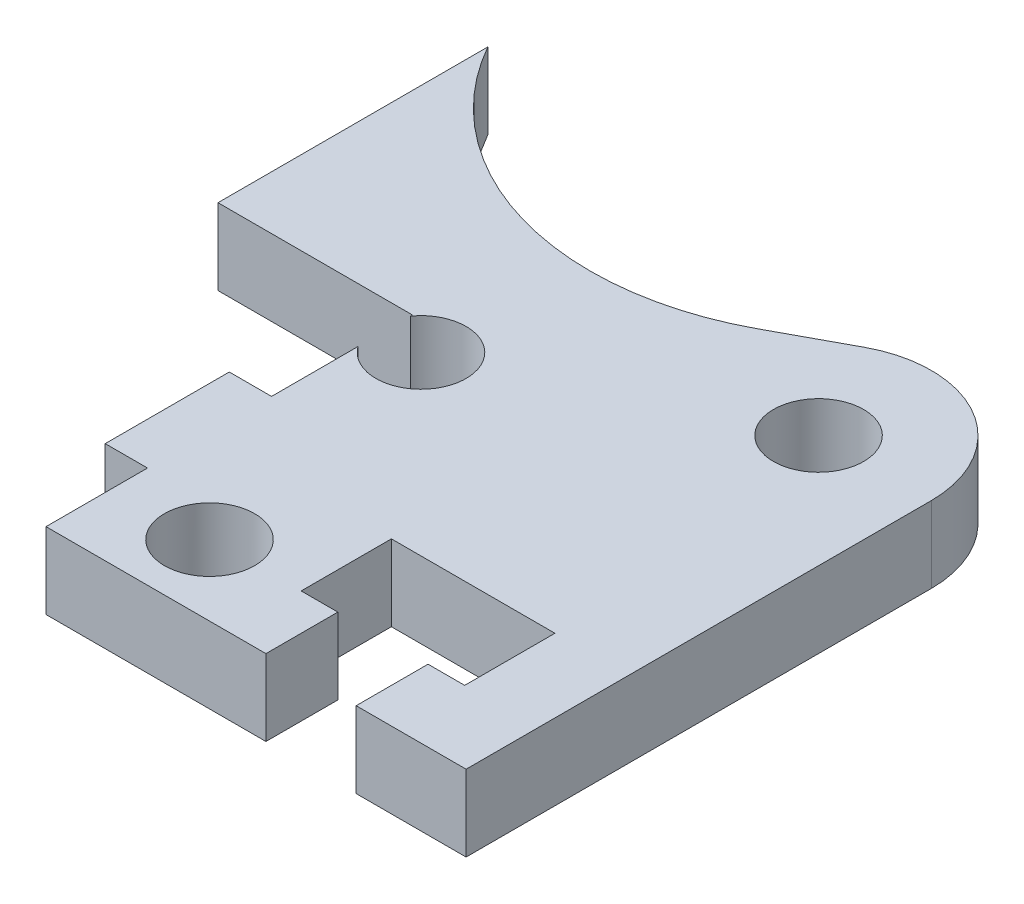
ISO-10303-21;
HEADER;
FILE_DESCRIPTION(('STEP AP214'),'2;1');
FILE_NAME('part.step','',(''),(''),'','','');
FILE_SCHEMA(('AUTOMOTIVE_DESIGN { 1 0 10303 214 1 1 1 1 }'));
ENDSEC;
DATA;
#1=APPLICATION_CONTEXT('core data for automotive mechanical design processes');
#2=APPLICATION_PROTOCOL_DEFINITION('international standard','automotive_design',2000,#1);
#3=PRODUCT_CONTEXT('',#1,'mechanical');
#4=PRODUCT('Part','Part','',(#3));
#5=PRODUCT_RELATED_PRODUCT_CATEGORY('part','',(#4));
#6=PRODUCT_DEFINITION_FORMATION('','',#4);
#7=PRODUCT_DEFINITION_CONTEXT('part definition',#1,'design');
#8=PRODUCT_DEFINITION('design','',#6,#7);
#9=PRODUCT_DEFINITION_SHAPE('','',#8);
#10=(LENGTH_UNIT() NAMED_UNIT(*) SI_UNIT(.MILLI.,.METRE.));
#11=(NAMED_UNIT(*) PLANE_ANGLE_UNIT() SI_UNIT($,.RADIAN.));
#12=(NAMED_UNIT(*) SI_UNIT($,.STERADIAN.) SOLID_ANGLE_UNIT());
#13=UNCERTAINTY_MEASURE_WITH_UNIT(LENGTH_MEASURE(1.E-05),#10,'distance_accuracy_value','');
#14=(GEOMETRIC_REPRESENTATION_CONTEXT(3) GLOBAL_UNCERTAINTY_ASSIGNED_CONTEXT((#13)) GLOBAL_UNIT_ASSIGNED_CONTEXT((#10,
#11,#12)) REPRESENTATION_CONTEXT('',''));
#15=CARTESIAN_POINT('',(0.,0.,0.));
#16=DIRECTION('',(0.,0.,1.));
#17=DIRECTION('',(1.,0.,0.));
#18=AXIS2_PLACEMENT_3D('',#15,#16,#17);
#19=CARTESIAN_POINT('',(0.,-1.35,0.));
#20=DIRECTION('',(0.,1.,0.));
#21=DIRECTION('',(1.,0.,0.));
#22=AXIS2_PLACEMENT_3D('',#19,#20,#21);
#23=PLANE('',#22);
#24=DIRECTION('',(1.,0.,0.));
#25=VECTOR('',#24,1.);
#26=CARTESIAN_POINT('',(14.2,-1.35,27.5));
#27=LINE('',#26,#25);
#28=CARTESIAN_POINT('',(14.2,-1.35,27.5));
#29=VERTEX_POINT('',#28);
#30=CARTESIAN_POINT('',(22.,-1.35,27.5));
#31=VERTEX_POINT('',#30);
#32=EDGE_CURVE('E35',#29,#31,#27,.T.);
#33=ORIENTED_EDGE('',*,*,#32,.F.);
#34=DIRECTION('',(0.,0.,-1.));
#35=VECTOR('',#34,1.);
#36=CARTESIAN_POINT('',(14.2,-1.35,27.5));
#37=LINE('',#36,#35);
#38=CARTESIAN_POINT('',(14.2,-1.35,23.9));
#39=VERTEX_POINT('',#38);
#40=EDGE_CURVE('E11',#29,#39,#37,.T.);
#41=ORIENTED_EDGE('',*,*,#40,.T.);
#42=DIRECTION('',(-1.,0.,0.));
#43=VECTOR('',#42,1.);
#44=CARTESIAN_POINT('',(14.2,-1.35,23.9));
#45=LINE('',#44,#43);
#46=CARTESIAN_POINT('',(12.7,-1.35,23.9));
#47=VERTEX_POINT('',#46);
#48=EDGE_CURVE('E27',#39,#47,#45,.T.);
#49=ORIENTED_EDGE('',*,*,#48,.T.);
#50=DIRECTION('',(0.,0.,-1.));
#51=VECTOR('',#50,1.);
#52=CARTESIAN_POINT('',(12.7,-1.35,23.9));
#53=LINE('',#52,#51);
#54=CARTESIAN_POINT('',(12.7,-1.35,19.5));
#55=VERTEX_POINT('',#54);
#56=EDGE_CURVE('E376',#47,#55,#53,.T.);
#57=ORIENTED_EDGE('',*,*,#56,.T.);
#58=DIRECTION('',(1.,0.,0.));
#59=VECTOR('',#58,1.);
#60=CARTESIAN_POINT('',(12.7,-1.35,19.5));
#61=LINE('',#60,#59);
#62=CARTESIAN_POINT('',(14.2,-1.35,19.5));
#63=VERTEX_POINT('',#62);
#64=EDGE_CURVE('E373',#55,#63,#61,.T.);
#65=ORIENTED_EDGE('',*,*,#64,.T.);
#66=DIRECTION('',(0.,0.,-1.));
#67=VECTOR('',#66,1.);
#68=CARTESIAN_POINT('',(14.2,-1.35,19.5));
#69=LINE('',#68,#67);
#70=CARTESIAN_POINT('',(14.2,-1.35,16.43273790531));
#71=VERTEX_POINT('',#70);
#72=EDGE_CURVE('E370',#63,#71,#69,.T.);
#73=ORIENTED_EDGE('',*,*,#72,.T.);
#74=CARTESIAN_POINT('',(15.5,-1.35,15.5));
#75=DIRECTION('',(0.,1.,0.));
#76=DIRECTION('',(-0.812499999999977,0.,0.582961190818083));
#77=AXIS2_PLACEMENT_3D('',#74,#75,#76);
#78=CIRCLE('',#77,1.6);
#79=CARTESIAN_POINT('',(14.2,-1.35,14.56726209469));
#80=VERTEX_POINT('',#79);
#81=EDGE_CURVE('E367',#71,#80,#78,.T.);
#82=ORIENTED_EDGE('',*,*,#81,.T.);
#83=DIRECTION('',(0.,0.,-1.));
#84=VECTOR('',#83,1.);
#85=CARTESIAN_POINT('',(14.2,-1.35,14.56726209469));
#86=LINE('',#85,#84);
#87=CARTESIAN_POINT('',(14.2,-1.35,14.5));
#88=VERTEX_POINT('',#87);
#89=EDGE_CURVE('E364',#80,#88,#86,.T.);
#90=ORIENTED_EDGE('',*,*,#89,.T.);
#91=DIRECTION('',(-1.,0.,0.));
#92=VECTOR('',#91,1.);
#93=CARTESIAN_POINT('',(14.2,-1.35,14.5));
#94=LINE('',#93,#92);
#95=CARTESIAN_POINT('',(7.3,-1.35,14.5));
#96=VERTEX_POINT('',#95);
#97=EDGE_CURVE('E361',#88,#96,#94,.T.);
#98=ORIENTED_EDGE('',*,*,#97,.T.);
#99=DIRECTION('',(0.,0.,-1.));
#100=VECTOR('',#99,1.);
#101=CARTESIAN_POINT('',(7.3,-1.35,14.5));
#102=LINE('',#101,#100);
#103=CARTESIAN_POINT('',(7.3,-1.35,4.930517214248));
#104=VERTEX_POINT('',#103);
#105=EDGE_CURVE('E358',#96,#104,#102,.T.);
#106=ORIENTED_EDGE('',*,*,#105,.T.);
#107=CARTESIAN_POINT('',(16.,-1.35,0.));
#108=DIRECTION('',(0.,1.,0.));
#109=DIRECTION('',(-0.870000000000018,0.,0.49305172142481));
#110=AXIS2_PLACEMENT_3D('',#107,#108,#109);
#111=CIRCLE('',#110,10.);
#112=CARTESIAN_POINT('',(20.74260267173,-1.35,8.803846880659));
#113=VERTEX_POINT('',#112);
#114=EDGE_CURVE('E355',#104,#113,#111,.T.);
#115=ORIENTED_EDGE('',*,*,#114,.T.);
#116=DIRECTION('',(0.880384688065945,0.,-0.474260267173024));
#117=VECTOR('',#116,1.);
#118=CARTESIAN_POINT('',(20.74260267173,-1.35,8.803846880659));
#119=LINE('',#118,#117);
#120=CARTESIAN_POINT('',(23.20295893131,-1.35,7.478461247736));
#121=VERTEX_POINT('',#120);
#122=EDGE_CURVE('E349',#113,#121,#119,.T.);
#123=ORIENTED_EDGE('',*,*,#122,.T.);
#124=CARTESIAN_POINT('',(25.1,-1.35,11.));
#125=DIRECTION('',(0.,1.,0.));
#126=DIRECTION('',(1.,0.,0.));
#127=AXIS2_PLACEMENT_3D('',#124,#125,#126);
#128=CIRCLE('',#127,4.);
#129=CARTESIAN_POINT('',(29.1,-1.35,11.));
#130=VERTEX_POINT('',#129);
#131=EDGE_CURVE('E249',#130,#121,#128,.T.);
#132=ORIENTED_EDGE('',*,*,#131,.F.);
#133=DIRECTION('',(0.,0.,-1.));
#134=VECTOR('',#133,1.);
#135=CARTESIAN_POINT('',(29.1,-1.35,27.5));
#136=LINE('',#135,#134);
#137=CARTESIAN_POINT('',(29.1,-1.35,27.5));
#138=VERTEX_POINT('',#137);
#139=EDGE_CURVE('E205',#138,#130,#136,.T.);
#140=ORIENTED_EDGE('',*,*,#139,.F.);
#141=DIRECTION('',(1.,0.,0.));
#142=VECTOR('',#141,1.);
#143=CARTESIAN_POINT('',(25.2,-1.35,27.5));
#144=LINE('',#143,#142);
#145=CARTESIAN_POINT('',(25.2,-1.35,27.5));
#146=VERTEX_POINT('',#145);
#147=EDGE_CURVE('E188',#146,#138,#144,.T.);
#148=ORIENTED_EDGE('',*,*,#147,.F.);
#149=DIRECTION('',(0.,0.,-1.));
#150=VECTOR('',#149,1.);
#151=CARTESIAN_POINT('',(25.2,-1.35,27.5));
#152=LINE('',#151,#150);
#153=CARTESIAN_POINT('',(25.2,-1.35,24.95));
#154=VERTEX_POINT('',#153);
#155=EDGE_CURVE('E347',#146,#154,#152,.T.);
#156=ORIENTED_EDGE('',*,*,#155,.T.);
#157=DIRECTION('',(1.,0.,0.));
#158=VECTOR('',#157,1.);
#159=CARTESIAN_POINT('',(25.2,-1.35,24.95));
#160=LINE('',#159,#158);
#161=CARTESIAN_POINT('',(26.5,-1.35,24.95));
#162=VERTEX_POINT('',#161);
#163=EDGE_CURVE('E344',#154,#162,#160,.T.);
#164=ORIENTED_EDGE('',*,*,#163,.T.);
#165=DIRECTION('',(0.,0.,-1.));
#166=VECTOR('',#165,1.);
#167=CARTESIAN_POINT('',(26.5,-1.35,24.95));
#168=LINE('',#167,#166);
#169=CARTESIAN_POINT('',(26.5,-1.35,21.75));
#170=VERTEX_POINT('',#169);
#171=EDGE_CURVE('E340',#162,#170,#168,.T.);
#172=ORIENTED_EDGE('',*,*,#171,.T.);
#173=DIRECTION('',(-1.,0.,0.));
#174=VECTOR('',#173,1.);
#175=CARTESIAN_POINT('',(26.5,-1.35,21.75));
#176=LINE('',#175,#174);
#177=CARTESIAN_POINT('',(20.7,-1.35,21.75));
#178=VERTEX_POINT('',#177);
#179=EDGE_CURVE('E338',#170,#178,#176,.T.);
#180=ORIENTED_EDGE('',*,*,#179,.T.);
#181=DIRECTION('',(0.,0.,1.));
#182=VECTOR('',#181,1.);
#183=CARTESIAN_POINT('',(20.7,-1.35,21.75));
#184=LINE('',#183,#182);
#185=CARTESIAN_POINT('',(20.7,-1.35,24.95));
#186=VERTEX_POINT('',#185);
#187=EDGE_CURVE('E333',#178,#186,#184,.T.);
#188=ORIENTED_EDGE('',*,*,#187,.T.);
#189=DIRECTION('',(1.,0.,0.));
#190=VECTOR('',#189,1.);
#191=CARTESIAN_POINT('',(20.7,-1.35,24.95));
#192=LINE('',#191,#190);
#193=CARTESIAN_POINT('',(22.,-1.35,24.95));
#194=VERTEX_POINT('',#193);
#195=EDGE_CURVE('E331',#186,#194,#192,.T.);
#196=ORIENTED_EDGE('',*,*,#195,.T.);
#197=DIRECTION('',(0.,0.,-1.));
#198=VECTOR('',#197,1.);
#199=CARTESIAN_POINT('',(22.,-1.35,27.5));
#200=LINE('',#199,#198);
#201=EDGE_CURVE('E190',#31,#194,#200,.T.);
#202=ORIENTED_EDGE('',*,*,#201,.F.);
#203=EDGE_LOOP('',(#33,#41,#49,#57,#65,#73,#82,#90,#98,#106,#115,#123,#132,#140,#148,#156,#164,
#172,#180,#188,#196,#202));
#204=FACE_BOUND('',#203,.T.);
#205=CARTESIAN_POINT('',(17.5,-1.35,25.));
#206=DIRECTION('',(0.,-1.,0.));
#207=DIRECTION('',(-1.,0.,0.));
#208=AXIS2_PLACEMENT_3D('',#205,#206,#207);
#209=CIRCLE('',#208,1.6);
#210=CARTESIAN_POINT('',(15.9,-1.35,25.));
#211=VERTEX_POINT('',#210);
#212=EDGE_CURVE('E285',#211,#211,#209,.T.);
#213=ORIENTED_EDGE('',*,*,#212,.F.);
#214=EDGE_LOOP('',(#213));
#215=FACE_BOUND('',#214,.T.);
#216=CARTESIAN_POINT('',(25.1,-1.35,11.));
#217=DIRECTION('',(0.,-1.,0.));
#218=DIRECTION('',(-1.,0.,0.));
#219=AXIS2_PLACEMENT_3D('',#216,#217,#218);
#220=CIRCLE('',#219,1.6);
#221=CARTESIAN_POINT('',(23.5,-1.35,11.));
#222=VERTEX_POINT('',#221);
#223=EDGE_CURVE('E312',#222,#222,#220,.T.);
#224=ORIENTED_EDGE('',*,*,#223,.F.);
#225=EDGE_LOOP('',(#224));
#226=FACE_BOUND('',#225,.T.);
#227=ADVANCED_FACE('F17',(#204,#215,#226),#23,.F.);
#228=CARTESIAN_POINT('',(17.5,1.35,25.));
#229=DIRECTION('',(0.,-1.,0.));
#230=DIRECTION('',(1.,0.,0.));
#231=AXIS2_PLACEMENT_3D('',#228,#229,#230);
#232=CYLINDRICAL_SURFACE('',#231,1.6);
#233=ORIENTED_EDGE('',*,*,#212,.T.);
#234=EDGE_LOOP('',(#233));
#235=FACE_BOUND('',#234,.T.);
#236=CARTESIAN_POINT('',(17.5,1.35,25.));
#237=DIRECTION('',(0.,-1.,0.));
#238=DIRECTION('',(1.,0.,0.));
#239=AXIS2_PLACEMENT_3D('',#236,#237,#238);
#240=CIRCLE('',#239,1.6);
#241=CARTESIAN_POINT('',(19.1,1.35,25.));
#242=VERTEX_POINT('',#241);
#243=EDGE_CURVE('E178',#242,#242,#240,.T.);
#244=ORIENTED_EDGE('',*,*,#243,.F.);
#245=EDGE_LOOP('',(#244));
#246=FACE_BOUND('',#245,.T.);
#247=ADVANCED_FACE('F443',(#235,#246),#232,.F.);
#248=CARTESIAN_POINT('',(0.,1.35,0.));
#249=DIRECTION('',(0.,1.,0.));
#250=DIRECTION('',(1.,0.,0.));
#251=AXIS2_PLACEMENT_3D('',#248,#249,#250);
#252=PLANE('',#251);
#253=DIRECTION('',(1.,0.,0.));
#254=VECTOR('',#253,1.);
#255=CARTESIAN_POINT('',(20.7,1.35,24.95));
#256=LINE('',#255,#254);
#257=CARTESIAN_POINT('',(20.7,1.35,24.95));
#258=VERTEX_POINT('',#257);
#259=CARTESIAN_POINT('',(22.,1.35,24.95));
#260=VERTEX_POINT('',#259);
#261=EDGE_CURVE('E279',#258,#260,#256,.T.);
#262=ORIENTED_EDGE('',*,*,#261,.F.);
#263=DIRECTION('',(0.,0.,1.));
#264=VECTOR('',#263,1.);
#265=CARTESIAN_POINT('',(20.7,1.35,21.75));
#266=LINE('',#265,#264);
#267=CARTESIAN_POINT('',(20.7,1.35,21.75));
#268=VERTEX_POINT('',#267);
#269=EDGE_CURVE('E257',#268,#258,#266,.T.);
#270=ORIENTED_EDGE('',*,*,#269,.F.);
#271=DIRECTION('',(-1.,0.,0.));
#272=VECTOR('',#271,1.);
#273=CARTESIAN_POINT('',(26.5,1.35,21.75));
#274=LINE('',#273,#272);
#275=CARTESIAN_POINT('',(26.5,1.35,21.75));
#276=VERTEX_POINT('',#275);
#277=EDGE_CURVE('E261',#276,#268,#274,.T.);
#278=ORIENTED_EDGE('',*,*,#277,.F.);
#279=DIRECTION('',(0.,0.,-1.));
#280=VECTOR('',#279,1.);
#281=CARTESIAN_POINT('',(26.5,1.35,24.95));
#282=LINE('',#281,#280);
#283=CARTESIAN_POINT('',(26.5,1.35,24.95));
#284=VERTEX_POINT('',#283);
#285=EDGE_CURVE('E266',#284,#276,#282,.T.);
#286=ORIENTED_EDGE('',*,*,#285,.F.);
#287=DIRECTION('',(1.,0.,0.));
#288=VECTOR('',#287,1.);
#289=CARTESIAN_POINT('',(25.2,1.35,24.95));
#290=LINE('',#289,#288);
#291=CARTESIAN_POINT('',(25.2,1.35,24.95));
#292=VERTEX_POINT('',#291);
#293=EDGE_CURVE('E263',#292,#284,#290,.T.);
#294=ORIENTED_EDGE('',*,*,#293,.F.);
#295=DIRECTION('',(0.,0.,-1.));
#296=VECTOR('',#295,1.);
#297=CARTESIAN_POINT('',(25.2,1.35,27.5));
#298=LINE('',#297,#296);
#299=CARTESIAN_POINT('',(25.2,1.35,27.5));
#300=VERTEX_POINT('',#299);
#301=EDGE_CURVE('E206',#300,#292,#298,.T.);
#302=ORIENTED_EDGE('',*,*,#301,.F.);
#303=DIRECTION('',(1.,0.,0.));
#304=VECTOR('',#303,1.);
#305=CARTESIAN_POINT('',(25.2,1.35,27.5));
#306=LINE('',#305,#304);
#307=CARTESIAN_POINT('',(29.1,1.35,27.5));
#308=VERTEX_POINT('',#307);
#309=EDGE_CURVE('E282',#300,#308,#306,.T.);
#310=ORIENTED_EDGE('',*,*,#309,.T.);
#311=DIRECTION('',(0.,0.,-1.));
#312=VECTOR('',#311,1.);
#313=CARTESIAN_POINT('',(29.1,1.35,27.5));
#314=LINE('',#313,#312);
#315=CARTESIAN_POINT('',(29.1,1.35,11.));
#316=VERTEX_POINT('',#315);
#317=EDGE_CURVE('E286',#308,#316,#314,.T.);
#318=ORIENTED_EDGE('',*,*,#317,.T.);
#319=CARTESIAN_POINT('',(25.1,1.35,11.));
#320=DIRECTION('',(0.,1.,0.));
#321=DIRECTION('',(1.,0.,0.));
#322=AXIS2_PLACEMENT_3D('',#319,#320,#321);
#323=CIRCLE('',#322,4.);
#324=CARTESIAN_POINT('',(23.20295893131,1.35,7.478461247736));
#325=VERTEX_POINT('',#324);
#326=EDGE_CURVE('E289',#316,#325,#323,.T.);
#327=ORIENTED_EDGE('',*,*,#326,.T.);
#328=DIRECTION('',(0.880384688065945,0.,-0.474260267173024));
#329=VECTOR('',#328,1.);
#330=CARTESIAN_POINT('',(20.74260267173,1.35,8.803846880659));
#331=LINE('',#330,#329);
#332=CARTESIAN_POINT('',(20.74260267173,1.35,8.803846880659));
#333=VERTEX_POINT('',#332);
#334=EDGE_CURVE('E242',#333,#325,#331,.T.);
#335=ORIENTED_EDGE('',*,*,#334,.F.);
#336=CARTESIAN_POINT('',(16.,1.35,0.));
#337=DIRECTION('',(0.,1.,0.));
#338=DIRECTION('',(-0.870000000000018,0.,0.49305172142481));
#339=AXIS2_PLACEMENT_3D('',#336,#337,#338);
#340=CIRCLE('',#339,10.);
#341=CARTESIAN_POINT('',(7.3,1.35,4.930517214248));
#342=VERTEX_POINT('',#341);
#343=EDGE_CURVE('E245',#342,#333,#340,.T.);
#344=ORIENTED_EDGE('',*,*,#343,.F.);
#345=DIRECTION('',(0.,0.,-1.));
#346=VECTOR('',#345,1.);
#347=CARTESIAN_POINT('',(7.3,1.35,14.5));
#348=LINE('',#347,#346);
#349=CARTESIAN_POINT('',(7.3,1.35,14.5));
#350=VERTEX_POINT('',#349);
#351=EDGE_CURVE('E237',#350,#342,#348,.T.);
#352=ORIENTED_EDGE('',*,*,#351,.F.);
#353=DIRECTION('',(-1.,0.,0.));
#354=VECTOR('',#353,1.);
#355=CARTESIAN_POINT('',(14.2,1.35,14.5));
#356=LINE('',#355,#354);
#357=CARTESIAN_POINT('',(14.2,1.35,14.5));
#358=VERTEX_POINT('',#357);
#359=EDGE_CURVE('E233',#358,#350,#356,.T.);
#360=ORIENTED_EDGE('',*,*,#359,.F.);
#361=DIRECTION('',(0.,0.,-1.));
#362=VECTOR('',#361,1.);
#363=CARTESIAN_POINT('',(14.2,1.35,14.56726209469));
#364=LINE('',#363,#362);
#365=CARTESIAN_POINT('',(14.2,1.35,14.56726209469));
#366=VERTEX_POINT('',#365);
#367=EDGE_CURVE('E226',#366,#358,#364,.T.);
#368=ORIENTED_EDGE('',*,*,#367,.F.);
#369=CARTESIAN_POINT('',(15.5,1.35,15.5));
#370=DIRECTION('',(0.,-1.,0.));
#371=DIRECTION('',(-0.812499999999977,0.,-0.582961190818083));
#372=AXIS2_PLACEMENT_3D('',#369,#370,#371);
#373=CIRCLE('',#372,1.6);
#374=CARTESIAN_POINT('',(14.2,1.35,16.43273790531));
#375=VERTEX_POINT('',#374);
#376=EDGE_CURVE('E185',#366,#375,#373,.T.);
#377=ORIENTED_EDGE('',*,*,#376,.T.);
#378=DIRECTION('',(0.,0.,-1.));
#379=VECTOR('',#378,1.);
#380=CARTESIAN_POINT('',(14.2,1.35,19.5));
#381=LINE('',#380,#379);
#382=CARTESIAN_POINT('',(14.2,1.35,19.5));
#383=VERTEX_POINT('',#382);
#384=EDGE_CURVE('E222',#383,#375,#381,.T.);
#385=ORIENTED_EDGE('',*,*,#384,.F.);
#386=DIRECTION('',(1.,0.,0.));
#387=VECTOR('',#386,1.);
#388=CARTESIAN_POINT('',(12.7,1.35,19.5));
#389=LINE('',#388,#387);
#390=CARTESIAN_POINT('',(12.7,1.35,19.5));
#391=VERTEX_POINT('',#390);
#392=EDGE_CURVE('E218',#391,#383,#389,.T.);
#393=ORIENTED_EDGE('',*,*,#392,.F.);
#394=DIRECTION('',(0.,0.,-1.));
#395=VECTOR('',#394,1.);
#396=CARTESIAN_POINT('',(12.7,1.35,23.9));
#397=LINE('',#396,#395);
#398=CARTESIAN_POINT('',(12.7,1.35,23.9));
#399=VERTEX_POINT('',#398);
#400=EDGE_CURVE('E214',#399,#391,#397,.T.);
#401=ORIENTED_EDGE('',*,*,#400,.F.);
#402=DIRECTION('',(-1.,0.,0.));
#403=VECTOR('',#402,1.);
#404=CARTESIAN_POINT('',(14.2,1.35,23.9));
#405=LINE('',#404,#403);
#406=CARTESIAN_POINT('',(14.2,1.35,23.9));
#407=VERTEX_POINT('',#406);
#408=EDGE_CURVE('E210',#407,#399,#405,.T.);
#409=ORIENTED_EDGE('',*,*,#408,.F.);
#410=DIRECTION('',(0.,0.,-1.));
#411=VECTOR('',#410,1.);
#412=CARTESIAN_POINT('',(14.2,1.35,27.5));
#413=LINE('',#412,#411);
#414=CARTESIAN_POINT('',(14.2,1.35,27.5));
#415=VERTEX_POINT('',#414);
#416=EDGE_CURVE('E163',#415,#407,#413,.T.);
#417=ORIENTED_EDGE('',*,*,#416,.F.);
#418=DIRECTION('',(1.,0.,0.));
#419=VECTOR('',#418,1.);
#420=CARTESIAN_POINT('',(14.2,1.35,27.5));
#421=LINE('',#420,#419);
#422=CARTESIAN_POINT('',(22.,1.35,27.5));
#423=VERTEX_POINT('',#422);
#424=EDGE_CURVE('E177',#415,#423,#421,.T.);
#425=ORIENTED_EDGE('',*,*,#424,.T.);
#426=DIRECTION('',(0.,0.,-1.));
#427=VECTOR('',#426,1.);
#428=CARTESIAN_POINT('',(22.,1.35,27.5));
#429=LINE('',#428,#427);
#430=EDGE_CURVE('E170',#423,#260,#429,.T.);
#431=ORIENTED_EDGE('',*,*,#430,.T.);
#432=EDGE_LOOP('',(#262,#270,#278,#286,#294,#302,#310,#318,#327,#335,#344,#352,#360,#368,#377,
#385,#393,#401,#409,#417,#425,#431));
#433=FACE_BOUND('',#432,.T.);
#434=ORIENTED_EDGE('',*,*,#243,.T.);
#435=EDGE_LOOP('',(#434));
#436=FACE_BOUND('',#435,.T.);
#437=CARTESIAN_POINT('',(25.1,1.35,11.));
#438=DIRECTION('',(0.,-1.,0.));
#439=DIRECTION('',(-1.,0.,0.));
#440=AXIS2_PLACEMENT_3D('',#437,#438,#439);
#441=CIRCLE('',#440,1.6);
#442=CARTESIAN_POINT('',(23.5,1.35,11.));
#443=VERTEX_POINT('',#442);
#444=EDGE_CURVE('E310',#443,#443,#441,.T.);
#445=ORIENTED_EDGE('',*,*,#444,.T.);
#446=EDGE_LOOP('',(#445));
#447=FACE_BOUND('',#446,.T.);
#448=ADVANCED_FACE('F180',(#433,#436,#447),#252,.T.);
#449=CARTESIAN_POINT('',(25.1,1.35,11.));
#450=DIRECTION('',(0.,-1.,0.));
#451=DIRECTION('',(1.,0.,0.));
#452=AXIS2_PLACEMENT_3D('',#449,#450,#451);
#453=CYLINDRICAL_SURFACE('',#452,1.6);
#454=ORIENTED_EDGE('',*,*,#223,.T.);
#455=EDGE_LOOP('',(#454));
#456=FACE_BOUND('',#455,.T.);
#457=ORIENTED_EDGE('',*,*,#444,.F.);
#458=EDGE_LOOP('',(#457));
#459=FACE_BOUND('',#458,.T.);
#460=ADVANCED_FACE('F453',(#456,#459),#453,.F.);
#461=CARTESIAN_POINT('',(22.,1.35,24.95));
#462=DIRECTION('',(-1.,0.,0.));
#463=DIRECTION('',(0.,0.,1.));
#464=AXIS2_PLACEMENT_3D('',#461,#462,#463);
#465=PLANE('',#464);
#466=DIRECTION('',(0.,1.,0.));
#467=VECTOR('',#466,1.);
#468=CARTESIAN_POINT('',(22.,-1.35,24.95));
#469=LINE('',#468,#467);
#470=EDGE_CURVE('E175',#194,#260,#469,.T.);
#471=ORIENTED_EDGE('',*,*,#470,.T.);
#472=ORIENTED_EDGE('',*,*,#430,.F.);
#473=DIRECTION('',(0.,1.,0.));
#474=VECTOR('',#473,1.);
#475=CARTESIAN_POINT('',(22.,-1.35,27.5));
#476=LINE('',#475,#474);
#477=EDGE_CURVE('E173',#31,#423,#476,.T.);
#478=ORIENTED_EDGE('',*,*,#477,.F.);
#479=ORIENTED_EDGE('',*,*,#201,.T.);
#480=EDGE_LOOP('',(#471,#472,#478,#479));
#481=FACE_BOUND('',#480,.T.);
#482=ADVANCED_FACE('F171',(#481),#465,.F.);
#483=CARTESIAN_POINT('',(-21.,-1.35,27.5));
#484=DIRECTION('',(0.,0.,1.));
#485=DIRECTION('',(1.,0.,0.));
#486=AXIS2_PLACEMENT_3D('',#483,#484,#485);
#487=PLANE('',#486);
#488=ORIENTED_EDGE('',*,*,#424,.F.);
#489=DIRECTION('',(0.,1.,0.));
#490=VECTOR('',#489,1.);
#491=CARTESIAN_POINT('',(14.2,-1.35,27.5));
#492=LINE('',#491,#490);
#493=EDGE_CURVE('E198',#29,#415,#492,.T.);
#494=ORIENTED_EDGE('',*,*,#493,.F.);
#495=ORIENTED_EDGE('',*,*,#32,.T.);
#496=ORIENTED_EDGE('',*,*,#477,.T.);
#497=EDGE_LOOP('',(#488,#494,#495,#496));
#498=FACE_BOUND('',#497,.T.);
#499=ADVANCED_FACE('F187',(#498),#487,.T.);
#500=CARTESIAN_POINT('',(-21.,-1.35,27.5));
#501=DIRECTION('',(0.,0.,1.));
#502=DIRECTION('',(1.,0.,0.));
#503=AXIS2_PLACEMENT_3D('',#500,#501,#502);
#504=PLANE('',#503);
#505=ORIENTED_EDGE('',*,*,#147,.T.);
#506=DIRECTION('',(0.,1.,0.));
#507=VECTOR('',#506,1.);
#508=CARTESIAN_POINT('',(29.1,-1.35,27.5));
#509=LINE('',#508,#507);
#510=EDGE_CURVE('E193',#138,#308,#509,.T.);
#511=ORIENTED_EDGE('',*,*,#510,.T.);
#512=ORIENTED_EDGE('',*,*,#309,.F.);
#513=DIRECTION('',(0.,1.,0.));
#514=VECTOR('',#513,1.);
#515=CARTESIAN_POINT('',(25.2,-1.35,27.5));
#516=LINE('',#515,#514);
#517=EDGE_CURVE('E202',#146,#300,#516,.T.);
#518=ORIENTED_EDGE('',*,*,#517,.F.);
#519=EDGE_LOOP('',(#505,#511,#512,#518));
#520=FACE_BOUND('',#519,.T.);
#521=ADVANCED_FACE('F422',(#520),#504,.T.);
#522=CARTESIAN_POINT('',(14.2,1.35,27.5));
#523=DIRECTION('',(1.,0.,0.));
#524=DIRECTION('',(0.,0.,-1.));
#525=AXIS2_PLACEMENT_3D('',#522,#523,#524);
#526=PLANE('',#525);
#527=ORIENTED_EDGE('',*,*,#493,.T.);
#528=ORIENTED_EDGE('',*,*,#416,.T.);
#529=DIRECTION('',(0.,-1.,0.));
#530=VECTOR('',#529,1.);
#531=CARTESIAN_POINT('',(14.2,1.35,23.9));
#532=LINE('',#531,#530);
#533=EDGE_CURVE('E207',#407,#39,#532,.T.);
#534=ORIENTED_EDGE('',*,*,#533,.T.);
#535=ORIENTED_EDGE('',*,*,#40,.F.);
#536=EDGE_LOOP('',(#527,#528,#534,#535));
#537=FACE_BOUND('',#536,.T.);
#538=ADVANCED_FACE('F432',(#537),#526,.F.);
#539=CARTESIAN_POINT('',(14.2,1.35,23.9));
#540=DIRECTION('',(0.,0.,-1.));
#541=DIRECTION('',(-1.,0.,0.));
#542=AXIS2_PLACEMENT_3D('',#539,#540,#541);
#543=PLANE('',#542);
#544=ORIENTED_EDGE('',*,*,#533,.F.);
#545=ORIENTED_EDGE('',*,*,#408,.T.);
#546=DIRECTION('',(0.,-1.,0.));
#547=VECTOR('',#546,1.);
#548=CARTESIAN_POINT('',(12.7,1.35,23.9));
#549=LINE('',#548,#547);
#550=EDGE_CURVE('E211',#399,#47,#549,.T.);
#551=ORIENTED_EDGE('',*,*,#550,.T.);
#552=ORIENTED_EDGE('',*,*,#48,.F.);
#553=EDGE_LOOP('',(#544,#545,#551,#552));
#554=FACE_BOUND('',#553,.T.);
#555=ADVANCED_FACE('F383',(#554),#543,.F.);
#556=CARTESIAN_POINT('',(12.7,1.35,23.9));
#557=DIRECTION('',(1.,0.,0.));
#558=DIRECTION('',(0.,0.,-1.));
#559=AXIS2_PLACEMENT_3D('',#556,#557,#558);
#560=PLANE('',#559);
#561=ORIENTED_EDGE('',*,*,#550,.F.);
#562=ORIENTED_EDGE('',*,*,#400,.T.);
#563=DIRECTION('',(0.,-1.,0.));
#564=VECTOR('',#563,1.);
#565=CARTESIAN_POINT('',(12.7,1.35,19.5));
#566=LINE('',#565,#564);
#567=EDGE_CURVE('E215',#391,#55,#566,.T.);
#568=ORIENTED_EDGE('',*,*,#567,.T.);
#569=ORIENTED_EDGE('',*,*,#56,.F.);
#570=EDGE_LOOP('',(#561,#562,#568,#569));
#571=FACE_BOUND('',#570,.T.);
#572=ADVANCED_FACE('F385',(#571),#560,.F.);
#573=CARTESIAN_POINT('',(12.7,1.35,19.5));
#574=DIRECTION('',(0.,0.,1.));
#575=DIRECTION('',(1.,0.,0.));
#576=AXIS2_PLACEMENT_3D('',#573,#574,#575);
#577=PLANE('',#576);
#578=ORIENTED_EDGE('',*,*,#567,.F.);
#579=ORIENTED_EDGE('',*,*,#392,.T.);
#580=DIRECTION('',(0.,-1.,0.));
#581=VECTOR('',#580,1.);
#582=CARTESIAN_POINT('',(14.2,1.35,19.5));
#583=LINE('',#582,#581);
#584=EDGE_CURVE('E219',#383,#63,#583,.T.);
#585=ORIENTED_EDGE('',*,*,#584,.T.);
#586=ORIENTED_EDGE('',*,*,#64,.F.);
#587=EDGE_LOOP('',(#578,#579,#585,#586));
#588=FACE_BOUND('',#587,.T.);
#589=ADVANCED_FACE('F388',(#588),#577,.F.);
#590=CARTESIAN_POINT('',(14.2,1.35,19.5));
#591=DIRECTION('',(1.,0.,0.));
#592=DIRECTION('',(0.,0.,-1.));
#593=AXIS2_PLACEMENT_3D('',#590,#591,#592);
#594=PLANE('',#593);
#595=ORIENTED_EDGE('',*,*,#72,.F.);
#596=ORIENTED_EDGE('',*,*,#584,.F.);
#597=ORIENTED_EDGE('',*,*,#384,.T.);
#598=DIRECTION('',(0.,-1.,0.));
#599=VECTOR('',#598,1.);
#600=CARTESIAN_POINT('',(14.2,1.35,16.43273790531));
#601=LINE('',#600,#599);
#602=EDGE_CURVE('E223',#375,#71,#601,.T.);
#603=ORIENTED_EDGE('',*,*,#602,.T.);
#604=EDGE_LOOP('',(#595,#596,#597,#603));
#605=FACE_BOUND('',#604,.T.);
#606=ADVANCED_FACE('F392',(#605),#594,.F.);
#607=CARTESIAN_POINT('',(14.2,1.35,19.5));
#608=DIRECTION('',(1.,0.,0.));
#609=DIRECTION('',(0.,0.,-1.));
#610=AXIS2_PLACEMENT_3D('',#607,#608,#609);
#611=PLANE('',#610);
#612=ORIENTED_EDGE('',*,*,#367,.T.);
#613=DIRECTION('',(0.,-1.,0.));
#614=VECTOR('',#613,1.);
#615=CARTESIAN_POINT('',(14.2,1.35,14.5));
#616=LINE('',#615,#614);
#617=EDGE_CURVE('E227',#358,#88,#616,.T.);
#618=ORIENTED_EDGE('',*,*,#617,.T.);
#619=ORIENTED_EDGE('',*,*,#89,.F.);
#620=DIRECTION('',(0.,-1.,0.));
#621=VECTOR('',#620,1.);
#622=CARTESIAN_POINT('',(14.2,1.35,14.56726209469));
#623=LINE('',#622,#621);
#624=EDGE_CURVE('E230',#366,#80,#623,.T.);
#625=ORIENTED_EDGE('',*,*,#624,.F.);
#626=EDGE_LOOP('',(#612,#618,#619,#625));
#627=FACE_BOUND('',#626,.T.);
#628=ADVANCED_FACE('F398',(#627),#611,.F.);
#629=CARTESIAN_POINT('',(15.5,1.35,15.5));
#630=DIRECTION('',(0.,-1.,0.));
#631=DIRECTION('',(1.,0.,0.));
#632=AXIS2_PLACEMENT_3D('',#629,#630,#631);
#633=CYLINDRICAL_SURFACE('',#632,1.6);
#634=ORIENTED_EDGE('',*,*,#602,.F.);
#635=ORIENTED_EDGE('',*,*,#376,.F.);
#636=ORIENTED_EDGE('',*,*,#624,.T.);
#637=ORIENTED_EDGE('',*,*,#81,.F.);
#638=EDGE_LOOP('',(#634,#635,#636,#637));
#639=FACE_BOUND('',#638,.T.);
#640=ADVANCED_FACE('F395',(#639),#633,.F.);
#641=CARTESIAN_POINT('',(14.2,1.35,14.5));
#642=DIRECTION('',(0.,0.,-1.));
#643=DIRECTION('',(-1.,0.,0.));
#644=AXIS2_PLACEMENT_3D('',#641,#642,#643);
#645=PLANE('',#644);
#646=ORIENTED_EDGE('',*,*,#97,.F.);
#647=ORIENTED_EDGE('',*,*,#617,.F.);
#648=ORIENTED_EDGE('',*,*,#359,.T.);
#649=DIRECTION('',(0.,1.,0.));
#650=VECTOR('',#649,1.);
#651=CARTESIAN_POINT('',(7.3,-1.35,14.5));
#652=LINE('',#651,#650);
#653=EDGE_CURVE('E234',#96,#350,#652,.T.);
#654=ORIENTED_EDGE('',*,*,#653,.F.);
#655=EDGE_LOOP('',(#646,#647,#648,#654));
#656=FACE_BOUND('',#655,.T.);
#657=ADVANCED_FACE('F403',(#656),#645,.F.);
#658=CARTESIAN_POINT('',(7.3,-1.62,27.5));
#659=DIRECTION('',(1.,0.,0.));
#660=DIRECTION('',(0.,0.,-1.));
#661=AXIS2_PLACEMENT_3D('',#658,#659,#660);
#662=PLANE('',#661);
#663=ORIENTED_EDGE('',*,*,#653,.T.);
#664=ORIENTED_EDGE('',*,*,#351,.T.);
#665=DIRECTION('',(0.,1.,0.));
#666=VECTOR('',#665,1.);
#667=CARTESIAN_POINT('',(7.3,-1.35,4.930517214248));
#668=LINE('',#667,#666);
#669=EDGE_CURVE('E238',#104,#342,#668,.T.);
#670=ORIENTED_EDGE('',*,*,#669,.F.);
#671=ORIENTED_EDGE('',*,*,#105,.F.);
#672=EDGE_LOOP('',(#663,#664,#670,#671));
#673=FACE_BOUND('',#672,.T.);
#674=ADVANCED_FACE('F405',(#673),#662,.F.);
#675=CARTESIAN_POINT('',(16.,1.35,0.));
#676=DIRECTION('',(0.,1.,0.));
#677=DIRECTION('',(1.,0.,0.));
#678=AXIS2_PLACEMENT_3D('',#675,#676,#677);
#679=CYLINDRICAL_SURFACE('',#678,10.);
#680=ORIENTED_EDGE('',*,*,#343,.T.);
#681=DIRECTION('',(0.,-1.,0.));
#682=VECTOR('',#681,1.);
#683=CARTESIAN_POINT('',(20.74260267173,1.35,8.803846880659));
#684=LINE('',#683,#682);
#685=EDGE_CURVE('E241',#333,#113,#684,.T.);
#686=ORIENTED_EDGE('',*,*,#685,.T.);
#687=ORIENTED_EDGE('',*,*,#114,.F.);
#688=ORIENTED_EDGE('',*,*,#669,.T.);
#689=EDGE_LOOP('',(#680,#686,#687,#688));
#690=FACE_BOUND('',#689,.T.);
#691=ADVANCED_FACE('F407',(#690),#679,.F.);
#692=CARTESIAN_POINT('',(20.74260267173,1.35,8.803846880659));
#693=DIRECTION('',(0.474260267173024,0.,0.880384688065945));
#694=DIRECTION('',(0.880384688065945,0.,-0.474260267173024));
#695=AXIS2_PLACEMENT_3D('',#692,#693,#694);
#696=PLANE('',#695);
#697=ORIENTED_EDGE('',*,*,#685,.F.);
#698=ORIENTED_EDGE('',*,*,#334,.T.);
#699=DIRECTION('',(0.,-1.,0.));
#700=VECTOR('',#699,1.);
#701=CARTESIAN_POINT('',(23.20295893131,1.35,7.478461247736));
#702=LINE('',#701,#700);
#703=EDGE_CURVE('E246',#325,#121,#702,.T.);
#704=ORIENTED_EDGE('',*,*,#703,.T.);
#705=ORIENTED_EDGE('',*,*,#122,.F.);
#706=EDGE_LOOP('',(#697,#698,#704,#705));
#707=FACE_BOUND('',#706,.T.);
#708=ADVANCED_FACE('F413',(#707),#696,.F.);
#709=CARTESIAN_POINT('',(25.1,1.35,11.));
#710=DIRECTION('',(0.,1.,0.));
#711=DIRECTION('',(1.,0.,0.));
#712=AXIS2_PLACEMENT_3D('',#709,#710,#711);
#713=CYLINDRICAL_SURFACE('',#712,4.);
#714=ORIENTED_EDGE('',*,*,#703,.F.);
#715=ORIENTED_EDGE('',*,*,#326,.F.);
#716=DIRECTION('',(0.,1.,0.));
#717=VECTOR('',#716,1.);
#718=CARTESIAN_POINT('',(29.1,-1.35,11.));
#719=LINE('',#718,#717);
#720=EDGE_CURVE('E250',#130,#316,#719,.T.);
#721=ORIENTED_EDGE('',*,*,#720,.F.);
#722=ORIENTED_EDGE('',*,*,#131,.T.);
#723=EDGE_LOOP('',(#714,#715,#721,#722));
#724=FACE_BOUND('',#723,.T.);
#725=ADVANCED_FACE('F415',(#724),#713,.T.);
#726=CARTESIAN_POINT('',(29.1,-1.35,27.5));
#727=DIRECTION('',(1.,0.,0.));
#728=DIRECTION('',(0.,0.,-1.));
#729=AXIS2_PLACEMENT_3D('',#726,#727,#728);
#730=PLANE('',#729);
#731=ORIENTED_EDGE('',*,*,#720,.T.);
#732=ORIENTED_EDGE('',*,*,#317,.F.);
#733=ORIENTED_EDGE('',*,*,#510,.F.);
#734=ORIENTED_EDGE('',*,*,#139,.T.);
#735=EDGE_LOOP('',(#731,#732,#733,#734));
#736=FACE_BOUND('',#735,.T.);
#737=ADVANCED_FACE('F417',(#736),#730,.T.);
#738=CARTESIAN_POINT('',(25.2,1.35,27.5));
#739=DIRECTION('',(1.,0.,0.));
#740=DIRECTION('',(0.,0.,-1.));
#741=AXIS2_PLACEMENT_3D('',#738,#739,#740);
#742=PLANE('',#741);
#743=ORIENTED_EDGE('',*,*,#517,.T.);
#744=ORIENTED_EDGE('',*,*,#301,.T.);
#745=DIRECTION('',(0.,1.,0.));
#746=VECTOR('',#745,1.);
#747=CARTESIAN_POINT('',(25.2,-1.35,24.95));
#748=LINE('',#747,#746);
#749=EDGE_CURVE('E253',#154,#292,#748,.T.);
#750=ORIENTED_EDGE('',*,*,#749,.F.);
#751=ORIENTED_EDGE('',*,*,#155,.F.);
#752=EDGE_LOOP('',(#743,#744,#750,#751));
#753=FACE_BOUND('',#752,.T.);
#754=ADVANCED_FACE('F425',(#753),#742,.F.);
#755=CARTESIAN_POINT('',(20.7,1.35,24.95));
#756=DIRECTION('',(0.,0.,1.));
#757=DIRECTION('',(1.,0.,0.));
#758=AXIS2_PLACEMENT_3D('',#755,#756,#757);
#759=PLANE('',#758);
#760=ORIENTED_EDGE('',*,*,#195,.F.);
#761=DIRECTION('',(0.,-1.,0.));
#762=VECTOR('',#761,1.);
#763=CARTESIAN_POINT('',(20.7,1.35,24.95));
#764=LINE('',#763,#762);
#765=EDGE_CURVE('E258',#258,#186,#764,.T.);
#766=ORIENTED_EDGE('',*,*,#765,.F.);
#767=ORIENTED_EDGE('',*,*,#261,.T.);
#768=ORIENTED_EDGE('',*,*,#470,.F.);
#769=EDGE_LOOP('',(#760,#766,#767,#768));
#770=FACE_BOUND('',#769,.T.);
#771=ADVANCED_FACE('F329',(#770),#759,.F.);
#772=CARTESIAN_POINT('',(20.7,1.35,24.95));
#773=DIRECTION('',(0.,0.,1.));
#774=DIRECTION('',(1.,0.,0.));
#775=AXIS2_PLACEMENT_3D('',#772,#773,#774);
#776=PLANE('',#775);
#777=ORIENTED_EDGE('',*,*,#293,.T.);
#778=DIRECTION('',(0.,-1.,0.));
#779=VECTOR('',#778,1.);
#780=CARTESIAN_POINT('',(26.5,1.35,24.95));
#781=LINE('',#780,#779);
#782=EDGE_CURVE('E256',#284,#162,#781,.T.);
#783=ORIENTED_EDGE('',*,*,#782,.T.);
#784=ORIENTED_EDGE('',*,*,#163,.F.);
#785=ORIENTED_EDGE('',*,*,#749,.T.);
#786=EDGE_LOOP('',(#777,#783,#784,#785));
#787=FACE_BOUND('',#786,.T.);
#788=ADVANCED_FACE('F428',(#787),#776,.F.);
#789=CARTESIAN_POINT('',(20.7,1.35,21.75));
#790=DIRECTION('',(-1.,0.,0.));
#791=DIRECTION('',(0.,0.,1.));
#792=AXIS2_PLACEMENT_3D('',#789,#790,#791);
#793=PLANE('',#792);
#794=DIRECTION('',(0.,-1.,0.));
#795=VECTOR('',#794,1.);
#796=CARTESIAN_POINT('',(20.7,1.35,21.75));
#797=LINE('',#796,#795);
#798=EDGE_CURVE('E264',#268,#178,#797,.T.);
#799=ORIENTED_EDGE('',*,*,#798,.F.);
#800=ORIENTED_EDGE('',*,*,#269,.T.);
#801=ORIENTED_EDGE('',*,*,#765,.T.);
#802=ORIENTED_EDGE('',*,*,#187,.F.);
#803=EDGE_LOOP('',(#799,#800,#801,#802));
#804=FACE_BOUND('',#803,.T.);
#805=ADVANCED_FACE('F326',(#804),#793,.F.);
#806=CARTESIAN_POINT('',(26.5,1.35,21.75));
#807=DIRECTION('',(0.,0.,-1.));
#808=DIRECTION('',(-1.,0.,0.));
#809=AXIS2_PLACEMENT_3D('',#806,#807,#808);
#810=PLANE('',#809);
#811=DIRECTION('',(0.,-1.,0.));
#812=VECTOR('',#811,1.);
#813=CARTESIAN_POINT('',(26.5,1.35,21.75));
#814=LINE('',#813,#812);
#815=EDGE_CURVE('E21',#276,#170,#814,.T.);
#816=ORIENTED_EDGE('',*,*,#815,.F.);
#817=ORIENTED_EDGE('',*,*,#277,.T.);
#818=ORIENTED_EDGE('',*,*,#798,.T.);
#819=ORIENTED_EDGE('',*,*,#179,.F.);
#820=EDGE_LOOP('',(#816,#817,#818,#819));
#821=FACE_BOUND('',#820,.T.);
#822=ADVANCED_FACE('F430',(#821),#810,.F.);
#823=CARTESIAN_POINT('',(26.5,1.35,24.95));
#824=DIRECTION('',(1.,0.,0.));
#825=DIRECTION('',(0.,0.,-1.));
#826=AXIS2_PLACEMENT_3D('',#823,#824,#825);
#827=PLANE('',#826);
#828=ORIENTED_EDGE('',*,*,#782,.F.);
#829=ORIENTED_EDGE('',*,*,#285,.T.);
#830=ORIENTED_EDGE('',*,*,#815,.T.);
#831=ORIENTED_EDGE('',*,*,#171,.F.);
#832=EDGE_LOOP('',(#828,#829,#830,#831));
#833=FACE_BOUND('',#832,.T.);
#834=ADVANCED_FACE('F19',(#833),#827,.F.);
#835=CLOSED_SHELL('',(#227,#247,#448,#460,#482,#499,#521,#538,#555,#572,#589,#606,#628,#640,
#657,#674,#691,#708,#725,#737,#754,#771,#788,#805,#822,#834));
#836=MANIFOLD_SOLID_BREP('B1',#835);
#837=ADVANCED_BREP_SHAPE_REPRESENTATION('',(#18,#836),#14);
#838=SHAPE_DEFINITION_REPRESENTATION(#9,#837);
ENDSEC;
END-ISO-10303-21;
